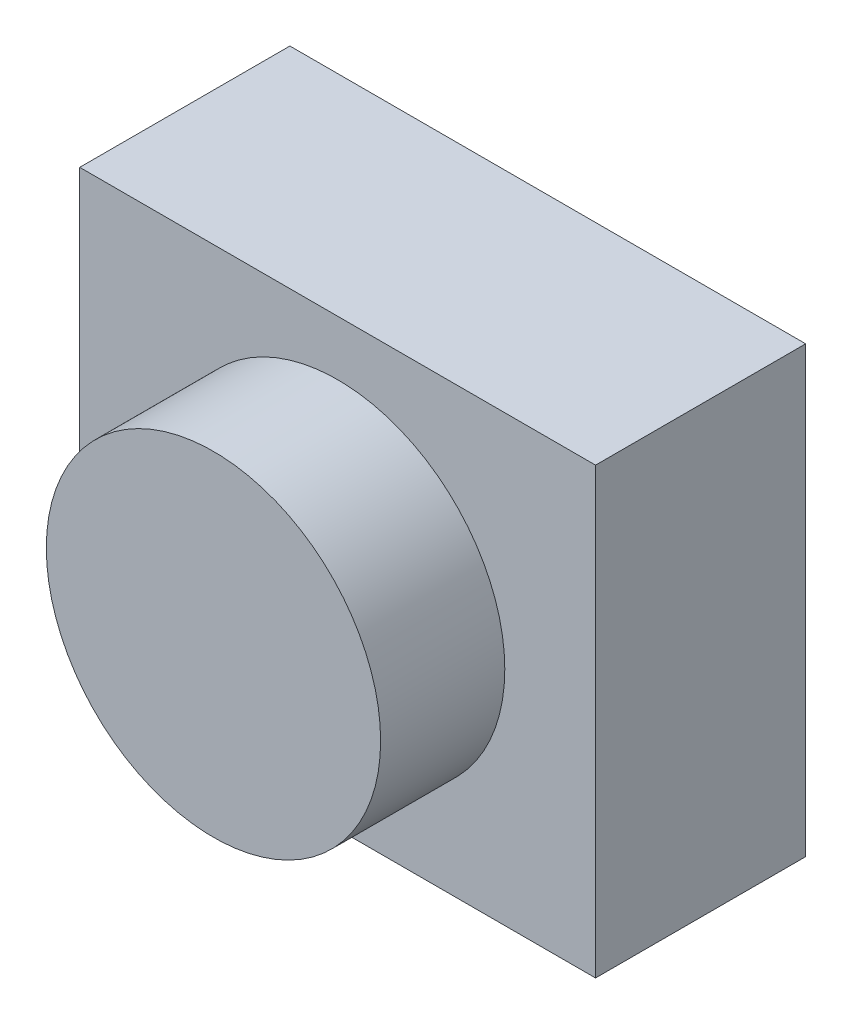
ISO-10303-21;
HEADER;
FILE_DESCRIPTION(('STEP AP214'),'2;1');
FILE_NAME('part.step','',(''),(''),'','','');
FILE_SCHEMA(('AUTOMOTIVE_DESIGN { 1 0 10303 214 1 1 1 1 }'));
ENDSEC;
DATA;
#1=APPLICATION_CONTEXT('core data for automotive mechanical design processes');
#2=APPLICATION_PROTOCOL_DEFINITION('international standard','automotive_design',2000,#1);
#3=PRODUCT_CONTEXT('',#1,'mechanical');
#4=PRODUCT('Part','Part','',(#3));
#5=PRODUCT_RELATED_PRODUCT_CATEGORY('part','',(#4));
#6=PRODUCT_DEFINITION_FORMATION('','',#4);
#7=PRODUCT_DEFINITION_CONTEXT('part definition',#1,'design');
#8=PRODUCT_DEFINITION('design','',#6,#7);
#9=PRODUCT_DEFINITION_SHAPE('','',#8);
#10=(LENGTH_UNIT() NAMED_UNIT(*) SI_UNIT(.MILLI.,.METRE.));
#11=(NAMED_UNIT(*) PLANE_ANGLE_UNIT() SI_UNIT($,.RADIAN.));
#12=(NAMED_UNIT(*) SI_UNIT($,.STERADIAN.) SOLID_ANGLE_UNIT());
#13=UNCERTAINTY_MEASURE_WITH_UNIT(LENGTH_MEASURE(1.E-05),#10,'distance_accuracy_value','');
#14=(GEOMETRIC_REPRESENTATION_CONTEXT(3) GLOBAL_UNCERTAINTY_ASSIGNED_CONTEXT((#13)) GLOBAL_UNIT_ASSIGNED_CONTEXT((#10,
#11,#12)) REPRESENTATION_CONTEXT('',''));
#15=CARTESIAN_POINT('',(0.,0.,0.));
#16=DIRECTION('',(0.,0.,1.));
#17=DIRECTION('',(1.,0.,0.));
#18=AXIS2_PLACEMENT_3D('',#15,#16,#17);
#19=CARTESIAN_POINT('',(27.,23.25,22.));
#20=DIRECTION('',(-1.,0.,0.));
#21=DIRECTION('',(0.,0.,1.));
#22=AXIS2_PLACEMENT_3D('',#19,#20,#21);
#23=PLANE('',#22);
#24=DIRECTION('',(0.,1.,0.));
#25=VECTOR('',#24,1.);
#26=CARTESIAN_POINT('',(27.,23.25,0.));
#27=LINE('',#26,#25);
#28=CARTESIAN_POINT('',(27.,-23.25,0.));
#29=VERTEX_POINT('',#28);
#30=CARTESIAN_POINT('',(27.,23.25,0.));
#31=VERTEX_POINT('',#30);
#32=EDGE_CURVE('E99',#29,#31,#27,.T.);
#33=ORIENTED_EDGE('',*,*,#32,.T.);
#34=DIRECTION('',(0.,0.,-1.));
#35=VECTOR('',#34,1.);
#36=CARTESIAN_POINT('',(27.,23.25,22.));
#37=LINE('',#36,#35);
#38=CARTESIAN_POINT('',(27.,23.25,22.));
#39=VERTEX_POINT('',#38);
#40=EDGE_CURVE('E36',#39,#31,#37,.T.);
#41=ORIENTED_EDGE('',*,*,#40,.F.);
#42=DIRECTION('',(0.,1.,0.));
#43=VECTOR('',#42,1.);
#44=CARTESIAN_POINT('',(27.,23.25,22.));
#45=LINE('',#44,#43);
#46=CARTESIAN_POINT('',(27.,-23.25,22.));
#47=VERTEX_POINT('',#46);
#48=EDGE_CURVE('E86',#47,#39,#45,.T.);
#49=ORIENTED_EDGE('',*,*,#48,.F.);
#50=DIRECTION('',(0.,0.,-1.));
#51=VECTOR('',#50,1.);
#52=CARTESIAN_POINT('',(27.,-23.25,22.));
#53=LINE('',#52,#51);
#54=EDGE_CURVE('E95',#47,#29,#53,.T.);
#55=ORIENTED_EDGE('',*,*,#54,.T.);
#56=EDGE_LOOP('',(#33,#41,#49,#55));
#57=FACE_BOUND('',#56,.T.);
#58=ADVANCED_FACE('F33',(#57),#23,.F.);
#59=CARTESIAN_POINT('',(-27.,23.25,22.));
#60=DIRECTION('',(0.,-1.,0.));
#61=DIRECTION('',(0.,0.,-1.));
#62=AXIS2_PLACEMENT_3D('',#59,#60,#61);
#63=PLANE('',#62);
#64=DIRECTION('',(-1.,0.,0.));
#65=VECTOR('',#64,1.);
#66=CARTESIAN_POINT('',(-27.,23.25,0.));
#67=LINE('',#66,#65);
#68=CARTESIAN_POINT('',(-27.,23.25,0.));
#69=VERTEX_POINT('',#68);
#70=EDGE_CURVE('E91',#31,#69,#67,.T.);
#71=ORIENTED_EDGE('',*,*,#70,.T.);
#72=DIRECTION('',(0.,0.,-1.));
#73=VECTOR('',#72,1.);
#74=CARTESIAN_POINT('',(-27.,23.25,22.));
#75=LINE('',#74,#73);
#76=CARTESIAN_POINT('',(-27.,23.25,22.));
#77=VERTEX_POINT('',#76);
#78=EDGE_CURVE('E89',#77,#69,#75,.T.);
#79=ORIENTED_EDGE('',*,*,#78,.F.);
#80=DIRECTION('',(-1.,0.,0.));
#81=VECTOR('',#80,1.);
#82=CARTESIAN_POINT('',(-27.,23.25,22.));
#83=LINE('',#82,#81);
#84=EDGE_CURVE('E81',#39,#77,#83,.T.);
#85=ORIENTED_EDGE('',*,*,#84,.F.);
#86=ORIENTED_EDGE('',*,*,#40,.T.);
#87=EDGE_LOOP('',(#71,#79,#85,#86));
#88=FACE_BOUND('',#87,.T.);
#89=ADVANCED_FACE('F90',(#88),#63,.F.);
#90=CARTESIAN_POINT('',(-27.,23.25,22.));
#91=DIRECTION('',(1.,0.,0.));
#92=DIRECTION('',(0.,0.,-1.));
#93=AXIS2_PLACEMENT_3D('',#90,#91,#92);
#94=PLANE('',#93);
#95=DIRECTION('',(0.,-1.,0.));
#96=VECTOR('',#95,1.);
#97=CARTESIAN_POINT('',(-27.,23.25,0.));
#98=LINE('',#97,#96);
#99=CARTESIAN_POINT('',(-27.,-23.25,0.));
#100=VERTEX_POINT('',#99);
#101=EDGE_CURVE('E67',#69,#100,#98,.T.);
#102=ORIENTED_EDGE('',*,*,#101,.T.);
#103=DIRECTION('',(0.,0.,-1.));
#104=VECTOR('',#103,1.);
#105=CARTESIAN_POINT('',(-27.,-23.25,22.));
#106=LINE('',#105,#104);
#107=CARTESIAN_POINT('',(-27.,-23.25,22.));
#108=VERTEX_POINT('',#107);
#109=EDGE_CURVE('E92',#108,#100,#106,.T.);
#110=ORIENTED_EDGE('',*,*,#109,.F.);
#111=DIRECTION('',(0.,-1.,0.));
#112=VECTOR('',#111,1.);
#113=CARTESIAN_POINT('',(-27.,23.25,22.));
#114=LINE('',#113,#112);
#115=EDGE_CURVE('E84',#77,#108,#114,.T.);
#116=ORIENTED_EDGE('',*,*,#115,.F.);
#117=ORIENTED_EDGE('',*,*,#78,.T.);
#118=EDGE_LOOP('',(#102,#110,#116,#117));
#119=FACE_BOUND('',#118,.T.);
#120=ADVANCED_FACE('F93',(#119),#94,.F.);
#121=CARTESIAN_POINT('',(-27.,-23.25,22.));
#122=DIRECTION('',(0.,1.,0.));
#123=DIRECTION('',(0.,0.,1.));
#124=AXIS2_PLACEMENT_3D('',#121,#122,#123);
#125=PLANE('',#124);
#126=DIRECTION('',(1.,0.,0.));
#127=VECTOR('',#126,1.);
#128=CARTESIAN_POINT('',(-27.,-23.25,0.));
#129=LINE('',#128,#127);
#130=EDGE_CURVE('E73',#100,#29,#129,.T.);
#131=ORIENTED_EDGE('',*,*,#130,.T.);
#132=ORIENTED_EDGE('',*,*,#54,.F.);
#133=DIRECTION('',(1.,0.,0.));
#134=VECTOR('',#133,1.);
#135=CARTESIAN_POINT('',(-27.,-23.25,22.));
#136=LINE('',#135,#134);
#137=EDGE_CURVE('E50',#108,#47,#136,.T.);
#138=ORIENTED_EDGE('',*,*,#137,.F.);
#139=ORIENTED_EDGE('',*,*,#109,.T.);
#140=EDGE_LOOP('',(#131,#132,#138,#139));
#141=FACE_BOUND('',#140,.T.);
#142=ADVANCED_FACE('F107',(#141),#125,.F.);
#143=CARTESIAN_POINT('',(0.,0.,22.));
#144=DIRECTION('',(0.,0.,1.));
#145=DIRECTION('',(1.,0.,0.));
#146=AXIS2_PLACEMENT_3D('',#143,#144,#145);
#147=PLANE('',#146);
#148=CARTESIAN_POINT('',(0.,0.,22.));
#149=DIRECTION('',(0.,0.,1.));
#150=DIRECTION('',(1.,0.,0.));
#151=AXIS2_PLACEMENT_3D('',#148,#149,#150);
#152=CIRCLE('',#151,17.5);
#153=CARTESIAN_POINT('',(-17.5,0.,22.));
#154=VERTEX_POINT('',#153);
#155=EDGE_CURVE('E11',#154,#154,#152,.T.);
#156=ORIENTED_EDGE('',*,*,#155,.F.);
#157=EDGE_LOOP('',(#156));
#158=FACE_BOUND('',#157,.T.);
#159=ORIENTED_EDGE('',*,*,#48,.T.);
#160=ORIENTED_EDGE('',*,*,#84,.T.);
#161=ORIENTED_EDGE('',*,*,#115,.T.);
#162=ORIENTED_EDGE('',*,*,#137,.T.);
#163=EDGE_LOOP('',(#159,#160,#161,#162));
#164=FACE_BOUND('',#163,.T.);
#165=ADVANCED_FACE('F82',(#158,#164),#147,.T.);
#166=CARTESIAN_POINT('',(0.,0.,0.));
#167=DIRECTION('',(0.,0.,1.));
#168=DIRECTION('',(1.,0.,0.));
#169=AXIS2_PLACEMENT_3D('',#166,#167,#168);
#170=PLANE('',#169);
#171=ORIENTED_EDGE('',*,*,#32,.F.);
#172=ORIENTED_EDGE('',*,*,#130,.F.);
#173=ORIENTED_EDGE('',*,*,#101,.F.);
#174=ORIENTED_EDGE('',*,*,#70,.F.);
#175=EDGE_LOOP('',(#171,#172,#173,#174));
#176=FACE_BOUND('',#175,.T.);
#177=ADVANCED_FACE('F110',(#176),#170,.F.);
#178=CARTESIAN_POINT('',(0.,0.,35.));
#179=DIRECTION('',(0.,0.,-1.));
#180=DIRECTION('',(-1.,0.,0.));
#181=AXIS2_PLACEMENT_3D('',#178,#179,#180);
#182=CYLINDRICAL_SURFACE('',#181,17.5);
#183=CARTESIAN_POINT('',(0.,0.,35.));
#184=DIRECTION('',(0.,0.,1.));
#185=DIRECTION('',(1.,0.,0.));
#186=AXIS2_PLACEMENT_3D('',#183,#184,#185);
#187=CIRCLE('',#186,17.5);
#188=CARTESIAN_POINT('',(-17.5,0.,35.));
#189=VERTEX_POINT('',#188);
#190=EDGE_CURVE('E102',#189,#189,#187,.T.);
#191=CARTESIAN_POINT('',(-17.5,0.,35.));
#192=CARTESIAN_POINT('',(-17.5,0.,34.8645833333333));
#193=CARTESIAN_POINT('',(-17.5,0.,34.7291666666667));
#194=CARTESIAN_POINT('',(-17.5,0.,34.4583333333333));
#195=CARTESIAN_POINT('',(-17.5,0.,34.3229166666667));
#196=CARTESIAN_POINT('',(-17.5,0.,34.0520833333333));
#197=CARTESIAN_POINT('',(-17.5,0.,33.9166666666667));
#198=CARTESIAN_POINT('',(-17.5,0.,33.6458333333333));
#199=CARTESIAN_POINT('',(-17.5,0.,33.5104166666667));
#200=CARTESIAN_POINT('',(-17.5,0.,33.2395833333333));
#201=CARTESIAN_POINT('',(-17.5,0.,33.1041666666667));
#202=CARTESIAN_POINT('',(-17.5,0.,32.8333333333333));
#203=CARTESIAN_POINT('',(-17.5,0.,32.6979166666667));
#204=CARTESIAN_POINT('',(-17.5,0.,32.4270833333333));
#205=CARTESIAN_POINT('',(-17.5,0.,32.2916666666667));
#206=CARTESIAN_POINT('',(-17.5,0.,32.0208333333333));
#207=CARTESIAN_POINT('',(-17.5,0.,31.8854166666667));
#208=CARTESIAN_POINT('',(-17.5,0.,31.6145833333333));
#209=CARTESIAN_POINT('',(-17.5,0.,31.4791666666667));
#210=CARTESIAN_POINT('',(-17.5,0.,31.2083333333333));
#211=CARTESIAN_POINT('',(-17.5,0.,31.0729166666667));
#212=CARTESIAN_POINT('',(-17.5,0.,30.8020833333333));
#213=CARTESIAN_POINT('',(-17.5,0.,30.6666666666667));
#214=CARTESIAN_POINT('',(-17.5,0.,30.3958333333333));
#215=CARTESIAN_POINT('',(-17.5,0.,30.2604166666667));
#216=CARTESIAN_POINT('',(-17.5,0.,29.9895833333333));
#217=CARTESIAN_POINT('',(-17.5,0.,29.8541666666667));
#218=CARTESIAN_POINT('',(-17.5,0.,29.5833333333333));
#219=CARTESIAN_POINT('',(-17.5,0.,29.4479166666667));
#220=CARTESIAN_POINT('',(-17.5,0.,29.1770833333333));
#221=CARTESIAN_POINT('',(-17.5,0.,29.0416666666667));
#222=CARTESIAN_POINT('',(-17.5,0.,28.7708333333333));
#223=CARTESIAN_POINT('',(-17.5,0.,28.6354166666667));
#224=CARTESIAN_POINT('',(-17.5,0.,28.3645833333333));
#225=CARTESIAN_POINT('',(-17.5,0.,28.2291666666667));
#226=CARTESIAN_POINT('',(-17.5,0.,27.9583333333333));
#227=CARTESIAN_POINT('',(-17.5,0.,27.8229166666667));
#228=CARTESIAN_POINT('',(-17.5,0.,27.5520833333333));
#229=CARTESIAN_POINT('',(-17.5,0.,27.4166666666667));
#230=CARTESIAN_POINT('',(-17.5,0.,27.1458333333333));
#231=CARTESIAN_POINT('',(-17.5,0.,27.0104166666667));
#232=CARTESIAN_POINT('',(-17.5,0.,26.7395833333333));
#233=CARTESIAN_POINT('',(-17.5,0.,26.6041666666667));
#234=CARTESIAN_POINT('',(-17.5,0.,26.3333333333333));
#235=CARTESIAN_POINT('',(-17.5,0.,26.1979166666667));
#236=CARTESIAN_POINT('',(-17.5,0.,25.9270833333333));
#237=CARTESIAN_POINT('',(-17.5,0.,25.7916666666667));
#238=CARTESIAN_POINT('',(-17.5,0.,25.5208333333333));
#239=CARTESIAN_POINT('',(-17.5,0.,25.3854166666667));
#240=CARTESIAN_POINT('',(-17.5,0.,25.1145833333333));
#241=CARTESIAN_POINT('',(-17.5,0.,24.9791666666667));
#242=CARTESIAN_POINT('',(-17.5,0.,24.7083333333333));
#243=CARTESIAN_POINT('',(-17.5,0.,24.5729166666667));
#244=CARTESIAN_POINT('',(-17.5,0.,24.3020833333333));
#245=CARTESIAN_POINT('',(-17.5,0.,24.1666666666667));
#246=CARTESIAN_POINT('',(-17.5,0.,23.8958333333333));
#247=CARTESIAN_POINT('',(-17.5,0.,23.7604166666667));
#248=CARTESIAN_POINT('',(-17.5,0.,23.4895833333333));
#249=CARTESIAN_POINT('',(-17.5,0.,23.3541666666667));
#250=CARTESIAN_POINT('',(-17.5,0.,23.0833333333333));
#251=CARTESIAN_POINT('',(-17.5,0.,22.9479166666667));
#252=CARTESIAN_POINT('',(-17.5,0.,22.6770833333333));
#253=CARTESIAN_POINT('',(-17.5,0.,22.5416666666667));
#254=CARTESIAN_POINT('',(-17.5,0.,22.2708333333333));
#255=CARTESIAN_POINT('',(-17.5,0.,22.1354166666667));
#256=CARTESIAN_POINT('',(-17.5,0.,22.));
#257=B_SPLINE_CURVE_WITH_KNOTS('',3,(#191,#192,#193,#194,#195,#196,#197,#198,#199,#200,#201,
#202,#203,#204,#205,#206,#207,#208,#209,#210,#211,#212,#213,#214,#215,#216,#217,#218,#219,#220,
#221,#222,#223,#224,#225,#226,#227,#228,#229,#230,#231,#232,#233,#234,#235,#236,#237,#238,#239,
#240,#241,#242,#243,#244,#245,#246,#247,#248,#249,#250,#251,#252,#253,#254,#255,#256),
.UNSPECIFIED.,.F.,.F.,(4,2,2,2,2,2,2,2,2,2,2,2,2,2,2,2,2,2,2,2,2,2,2,2,2,2,2,2,2,2,2,2,4),(0.,
0.406249999999997,0.812499999999994,1.21875,1.62499999999999,2.03125,2.4375,2.84374999999999,
3.25,3.65624999999999,4.0625,4.46874999999999,4.87499999999999,5.28124999999999,
5.68749999999999,6.09374999999999,6.5,6.90625,7.31249999999999,7.71874999999999,
8.12499999999999,8.53124999999999,8.93749999999999,9.34374999999999,9.74999999999999,10.15625,
10.5625,10.96875,11.375,11.78125,12.1875,12.59375,13.),.UNSPECIFIED.);
#258=EDGE_CURVE('BSEAM118',#189,#154,#257,.T.);
#259=ORIENTED_EDGE('',*,*,#190,.F.);
#260=ORIENTED_EDGE('',*,*,#155,.T.);
#261=ORIENTED_EDGE('',*,*,#258,.T.);
#262=ORIENTED_EDGE('',*,*,#258,.F.);
#263=EDGE_LOOP('',(#259,#261,#260,#262));
#264=FACE_BOUND('',#263,.T.);
#265=ADVANCED_FACE('F118',(#264),#182,.T.);
#266=CARTESIAN_POINT('',(0.,0.,35.));
#267=DIRECTION('',(0.,0.,1.));
#268=DIRECTION('',(1.,0.,0.));
#269=AXIS2_PLACEMENT_3D('',#266,#267,#268);
#270=PLANE('',#269);
#271=ORIENTED_EDGE('',*,*,#190,.T.);
#272=EDGE_LOOP('',(#271));
#273=FACE_BOUND('',#272,.T.);
#274=ADVANCED_FACE('F116',(#273),#270,.T.);
#275=CLOSED_SHELL('',(#58,#89,#120,#142,#165,#177,#265,#274));
#276=MANIFOLD_SOLID_BREP('B2',#275);
#277=ADVANCED_BREP_SHAPE_REPRESENTATION('',(#18,#276),#14);
#278=SHAPE_DEFINITION_REPRESENTATION(#9,#277);
ENDSEC;
END-ISO-10303-21;
